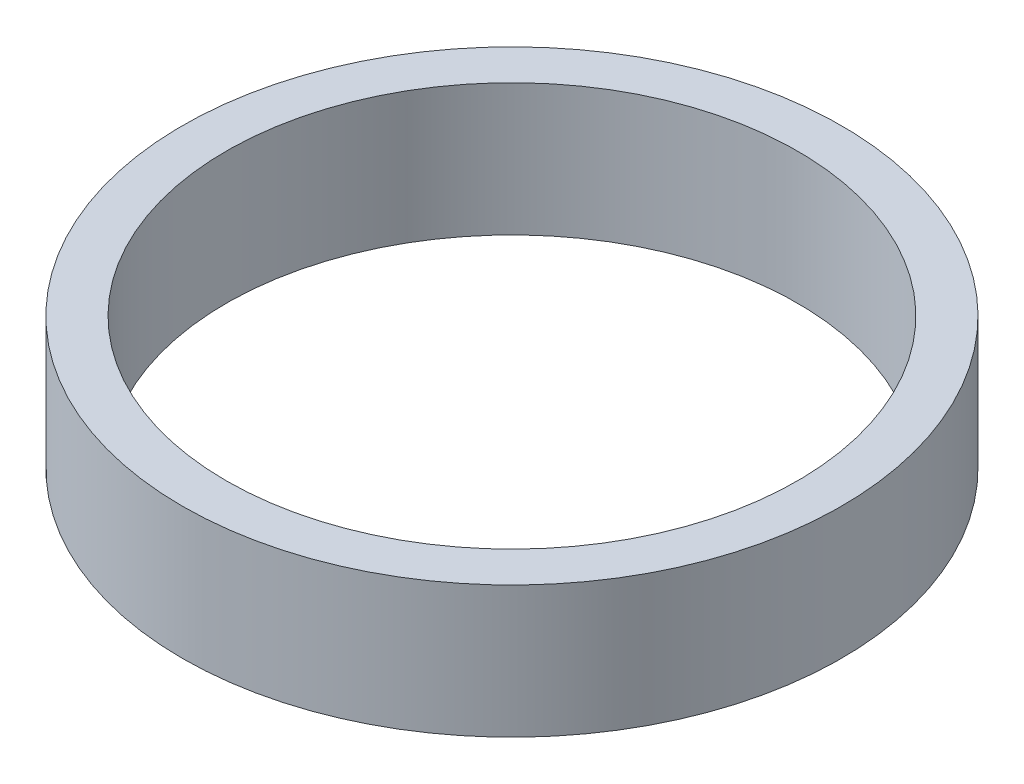
ISO-10303-21;
HEADER;
FILE_DESCRIPTION(('STEP AP214'),'2;1');
FILE_NAME('part.step','',(''),(''),'','','');
FILE_SCHEMA(('AUTOMOTIVE_DESIGN { 1 0 10303 214 1 1 1 1 }'));
ENDSEC;
DATA;
#1=APPLICATION_CONTEXT('core data for automotive mechanical design processes');
#2=APPLICATION_PROTOCOL_DEFINITION('international standard','automotive_design',2000,#1);
#3=PRODUCT_CONTEXT('',#1,'mechanical');
#4=PRODUCT('Part','Part','',(#3));
#5=PRODUCT_RELATED_PRODUCT_CATEGORY('part','',(#4));
#6=PRODUCT_DEFINITION_FORMATION('','',#4);
#7=PRODUCT_DEFINITION_CONTEXT('part definition',#1,'design');
#8=PRODUCT_DEFINITION('design','',#6,#7);
#9=PRODUCT_DEFINITION_SHAPE('','',#8);
#10=(LENGTH_UNIT() NAMED_UNIT(*) SI_UNIT(.MILLI.,.METRE.));
#11=(NAMED_UNIT(*) PLANE_ANGLE_UNIT() SI_UNIT($,.RADIAN.));
#12=(NAMED_UNIT(*) SI_UNIT($,.STERADIAN.) SOLID_ANGLE_UNIT());
#13=UNCERTAINTY_MEASURE_WITH_UNIT(LENGTH_MEASURE(1.E-05),#10,'distance_accuracy_value','');
#14=(GEOMETRIC_REPRESENTATION_CONTEXT(3) GLOBAL_UNCERTAINTY_ASSIGNED_CONTEXT((#13)) GLOBAL_UNIT_ASSIGNED_CONTEXT((#10,
#11,#12)) REPRESENTATION_CONTEXT('',''));
#15=CARTESIAN_POINT('',(0.,0.,0.));
#16=DIRECTION('',(0.,0.,1.));
#17=DIRECTION('',(1.,0.,0.));
#18=AXIS2_PLACEMENT_3D('',#15,#16,#17);
#19=CARTESIAN_POINT('',(0.,3.,0.));
#20=DIRECTION('',(0.,1.,0.));
#21=DIRECTION('',(0.,0.,1.));
#22=AXIS2_PLACEMENT_3D('',#19,#20,#21);
#23=PLANE('',#22);
#24=CARTESIAN_POINT('',(0.,3.,0.));
#25=DIRECTION('',(0.,1.,0.));
#26=DIRECTION('',(0.,0.,1.));
#27=AXIS2_PLACEMENT_3D('',#24,#25,#26);
#28=CIRCLE('',#27,7.5);
#29=CARTESIAN_POINT('',(0.,3.,7.5));
#30=VERTEX_POINT('',#29);
#31=EDGE_CURVE('E10',#30,#30,#28,.T.);
#32=ORIENTED_EDGE('',*,*,#31,.T.);
#33=EDGE_LOOP('',(#32));
#34=FACE_BOUND('',#33,.T.);
#35=CARTESIAN_POINT('',(0.,3.,0.));
#36=DIRECTION('',(0.,1.,0.));
#37=DIRECTION('',(0.,0.,1.));
#38=AXIS2_PLACEMENT_3D('',#35,#36,#37);
#39=CIRCLE('',#38,6.5);
#40=CARTESIAN_POINT('',(0.,3.,6.5));
#41=VERTEX_POINT('',#40);
#42=EDGE_CURVE('E42',#41,#41,#39,.T.);
#43=ORIENTED_EDGE('',*,*,#42,.F.);
#44=EDGE_LOOP('',(#43));
#45=FACE_BOUND('',#44,.T.);
#46=ADVANCED_FACE('F31',(#34,#45),#23,.T.);
#47=CARTESIAN_POINT('',(0.,0.,0.));
#48=DIRECTION('',(0.,1.,0.));
#49=DIRECTION('',(0.,0.,1.));
#50=AXIS2_PLACEMENT_3D('',#47,#48,#49);
#51=PLANE('',#50);
#52=CARTESIAN_POINT('',(0.,0.,0.));
#53=DIRECTION('',(0.,1.,0.));
#54=DIRECTION('',(0.,0.,1.));
#55=AXIS2_PLACEMENT_3D('',#52,#53,#54);
#56=CIRCLE('',#55,7.5);
#57=CARTESIAN_POINT('',(0.,0.,7.5));
#58=VERTEX_POINT('',#57);
#59=EDGE_CURVE('E35',#58,#58,#56,.T.);
#60=ORIENTED_EDGE('',*,*,#59,.F.);
#61=EDGE_LOOP('',(#60));
#62=FACE_BOUND('',#61,.T.);
#63=CARTESIAN_POINT('',(0.,0.,0.));
#64=DIRECTION('',(0.,1.,0.));
#65=DIRECTION('',(0.,0.,1.));
#66=AXIS2_PLACEMENT_3D('',#63,#64,#65);
#67=CIRCLE('',#66,6.5);
#68=CARTESIAN_POINT('',(0.,0.,6.5));
#69=VERTEX_POINT('',#68);
#70=EDGE_CURVE('E44',#69,#69,#67,.T.);
#71=ORIENTED_EDGE('',*,*,#70,.T.);
#72=EDGE_LOOP('',(#71));
#73=FACE_BOUND('',#72,.T.);
#74=ADVANCED_FACE('F54',(#62,#73),#51,.F.);
#75=CARTESIAN_POINT('',(0.,3.,0.));
#76=DIRECTION('',(0.,-1.,0.));
#77=DIRECTION('',(0.,0.,-1.));
#78=AXIS2_PLACEMENT_3D('',#75,#76,#77);
#79=CYLINDRICAL_SURFACE('',#78,7.5);
#80=ORIENTED_EDGE('',*,*,#31,.F.);
#81=EDGE_LOOP('',(#80));
#82=FACE_BOUND('',#81,.T.);
#83=ORIENTED_EDGE('',*,*,#59,.T.);
#84=EDGE_LOOP('',(#83));
#85=FACE_BOUND('',#84,.T.);
#86=ADVANCED_FACE('F33',(#82,#85),#79,.T.);
#87=CARTESIAN_POINT('',(0.,3.,0.));
#88=DIRECTION('',(0.,-1.,0.));
#89=DIRECTION('',(0.,0.,-1.));
#90=AXIS2_PLACEMENT_3D('',#87,#88,#89);
#91=CYLINDRICAL_SURFACE('',#90,6.5);
#92=ORIENTED_EDGE('',*,*,#42,.T.);
#93=EDGE_LOOP('',(#92));
#94=FACE_BOUND('',#93,.T.);
#95=ORIENTED_EDGE('',*,*,#70,.F.);
#96=EDGE_LOOP('',(#95));
#97=FACE_BOUND('',#96,.T.);
#98=ADVANCED_FACE('F50',(#94,#97),#91,.F.);
#99=CLOSED_SHELL('',(#46,#74,#86,#98));
#100=MANIFOLD_SOLID_BREP('B2',#99);
#101=ADVANCED_BREP_SHAPE_REPRESENTATION('',(#18,#100),#14);
#102=SHAPE_DEFINITION_REPRESENTATION(#9,#101);
ENDSEC;
END-ISO-10303-21;
